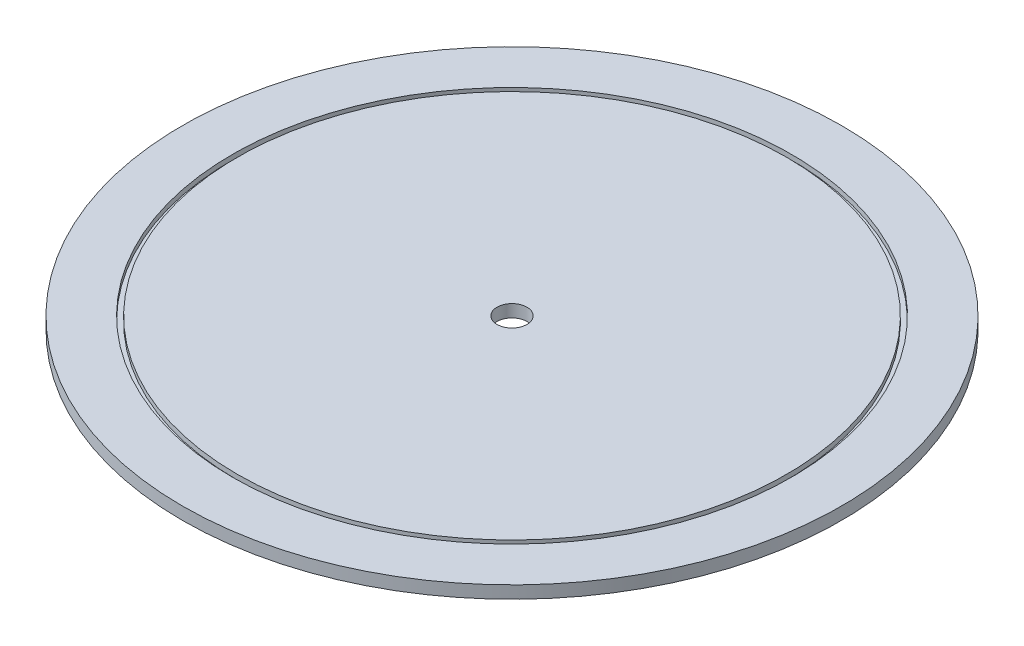
ISO-10303-21;
HEADER;
FILE_DESCRIPTION(('STEP AP214'),'2;1');
FILE_NAME('part.step','',(''),(''),'','','');
FILE_SCHEMA(('AUTOMOTIVE_DESIGN { 1 0 10303 214 1 1 1 1 }'));
ENDSEC;
DATA;
#1=APPLICATION_CONTEXT('core data for automotive mechanical design processes');
#2=APPLICATION_PROTOCOL_DEFINITION('international standard','automotive_design',2000,#1);
#3=PRODUCT_CONTEXT('',#1,'mechanical');
#4=PRODUCT('Part','Part','',(#3));
#5=PRODUCT_RELATED_PRODUCT_CATEGORY('part','',(#4));
#6=PRODUCT_DEFINITION_FORMATION('','',#4);
#7=PRODUCT_DEFINITION_CONTEXT('part definition',#1,'design');
#8=PRODUCT_DEFINITION('design','',#6,#7);
#9=PRODUCT_DEFINITION_SHAPE('','',#8);
#10=(LENGTH_UNIT() NAMED_UNIT(*) SI_UNIT(.MILLI.,.METRE.));
#11=(NAMED_UNIT(*) PLANE_ANGLE_UNIT() SI_UNIT($,.RADIAN.));
#12=(NAMED_UNIT(*) SI_UNIT($,.STERADIAN.) SOLID_ANGLE_UNIT());
#13=UNCERTAINTY_MEASURE_WITH_UNIT(LENGTH_MEASURE(1.E-05),#10,'distance_accuracy_value','');
#14=(GEOMETRIC_REPRESENTATION_CONTEXT(3) GLOBAL_UNCERTAINTY_ASSIGNED_CONTEXT((#13)) GLOBAL_UNIT_ASSIGNED_CONTEXT((#10,
#11,#12)) REPRESENTATION_CONTEXT('',''));
#15=CARTESIAN_POINT('',(0.,0.,0.));
#16=DIRECTION('',(0.,0.,1.));
#17=DIRECTION('',(1.,0.,0.));
#18=AXIS2_PLACEMENT_3D('',#15,#16,#17);
#19=CARTESIAN_POINT('',(0.,5.,0.));
#20=DIRECTION('',(0.,-1.,0.));
#21=DIRECTION('',(0.,0.,-1.));
#22=AXIS2_PLACEMENT_3D('',#19,#20,#21);
#23=CYLINDRICAL_SURFACE('',#22,132.);
#24=CARTESIAN_POINT('',(0.,5.,0.));
#25=DIRECTION('',(0.,1.,0.));
#26=DIRECTION('',(0.,0.,1.));
#27=AXIS2_PLACEMENT_3D('',#24,#25,#26);
#28=CIRCLE('',#27,132.);
#29=CARTESIAN_POINT('',(0.,5.,132.));
#30=VERTEX_POINT('',#29);
#31=EDGE_CURVE('E10',#30,#30,#28,.T.);
#32=ORIENTED_EDGE('',*,*,#31,.F.);
#33=EDGE_LOOP('',(#32));
#34=FACE_BOUND('',#33,.T.);
#35=CARTESIAN_POINT('',(0.,0.,0.));
#36=DIRECTION('',(0.,1.,0.));
#37=DIRECTION('',(0.,0.,1.));
#38=AXIS2_PLACEMENT_3D('',#35,#36,#37);
#39=CIRCLE('',#38,132.);
#40=CARTESIAN_POINT('',(0.,0.,132.));
#41=VERTEX_POINT('',#40);
#42=EDGE_CURVE('E46',#41,#41,#39,.T.);
#43=ORIENTED_EDGE('',*,*,#42,.T.);
#44=EDGE_LOOP('',(#43));
#45=FACE_BOUND('',#44,.T.);
#46=ADVANCED_FACE('F43',(#34,#45),#23,.T.);
#47=CARTESIAN_POINT('',(0.,5.,0.));
#48=DIRECTION('',(0.,1.,0.));
#49=DIRECTION('',(0.,0.,1.));
#50=AXIS2_PLACEMENT_3D('',#47,#48,#49);
#51=PLANE('',#50);
#52=CARTESIAN_POINT('',(0.,5.,0.));
#53=DIRECTION('',(0.,1.,0.));
#54=DIRECTION('',(0.,0.,1.));
#55=AXIS2_PLACEMENT_3D('',#52,#53,#54);
#56=CIRCLE('',#55,112.);
#57=CARTESIAN_POINT('',(0.,5.,112.));
#58=VERTEX_POINT('',#57);
#59=EDGE_CURVE('E57',#58,#58,#56,.T.);
#60=ORIENTED_EDGE('',*,*,#59,.F.);
#61=EDGE_LOOP('',(#60));
#62=FACE_BOUND('',#61,.T.);
#63=ORIENTED_EDGE('',*,*,#31,.T.);
#64=EDGE_LOOP('',(#63));
#65=FACE_BOUND('',#64,.T.);
#66=ADVANCED_FACE('F89',(#62,#65),#51,.T.);
#67=CARTESIAN_POINT('',(0.,0.,0.));
#68=DIRECTION('',(0.,1.,0.));
#69=DIRECTION('',(0.,0.,1.));
#70=AXIS2_PLACEMENT_3D('',#67,#68,#69);
#71=PLANE('',#70);
#72=CARTESIAN_POINT('',(0.,0.,0.));
#73=DIRECTION('',(0.,1.,0.));
#74=DIRECTION('',(0.,0.,1.));
#75=AXIS2_PLACEMENT_3D('',#72,#73,#74);
#76=CIRCLE('',#75,6.);
#77=CARTESIAN_POINT('',(0.,0.,6.));
#78=VERTEX_POINT('',#77);
#79=EDGE_CURVE('E69',#78,#78,#76,.T.);
#80=ORIENTED_EDGE('',*,*,#79,.T.);
#81=EDGE_LOOP('',(#80));
#82=FACE_BOUND('',#81,.T.);
#83=ORIENTED_EDGE('',*,*,#42,.F.);
#84=EDGE_LOOP('',(#83));
#85=FACE_BOUND('',#84,.T.);
#86=ADVANCED_FACE('F109',(#82,#85),#71,.F.);
#87=CARTESIAN_POINT('',(0.,3.,0.));
#88=DIRECTION('',(0.,1.,0.));
#89=DIRECTION('',(0.,0.,1.));
#90=AXIS2_PLACEMENT_3D('',#87,#88,#89);
#91=CYLINDRICAL_SURFACE('',#90,112.);
#92=CARTESIAN_POINT('',(0.,3.,0.));
#93=DIRECTION('',(0.,1.,0.));
#94=DIRECTION('',(0.,0.,1.));
#95=AXIS2_PLACEMENT_3D('',#92,#93,#94);
#96=CIRCLE('',#95,112.);
#97=CARTESIAN_POINT('',(0.,3.,112.));
#98=VERTEX_POINT('',#97);
#99=EDGE_CURVE('E55',#98,#98,#96,.T.);
#100=ORIENTED_EDGE('',*,*,#99,.F.);
#101=EDGE_LOOP('',(#100));
#102=FACE_BOUND('',#101,.T.);
#103=ORIENTED_EDGE('',*,*,#59,.T.);
#104=EDGE_LOOP('',(#103));
#105=FACE_BOUND('',#104,.T.);
#106=ADVANCED_FACE('F100',(#102,#105),#91,.F.);
#107=CARTESIAN_POINT('',(0.,3.,0.));
#108=DIRECTION('',(0.,1.,0.));
#109=DIRECTION('',(0.,0.,1.));
#110=AXIS2_PLACEMENT_3D('',#107,#108,#109);
#111=PLANE('',#110);
#112=CARTESIAN_POINT('',(0.,3.,0.));
#113=DIRECTION('',(0.,1.,0.));
#114=DIRECTION('',(0.,0.,1.));
#115=AXIS2_PLACEMENT_3D('',#112,#113,#114);
#116=CIRCLE('',#115,110.);
#117=CARTESIAN_POINT('',(0.,3.,110.));
#118=VERTEX_POINT('',#117);
#119=EDGE_CURVE('E61',#118,#118,#116,.T.);
#120=ORIENTED_EDGE('',*,*,#119,.F.);
#121=EDGE_LOOP('',(#120));
#122=FACE_BOUND('',#121,.T.);
#123=ORIENTED_EDGE('',*,*,#99,.T.);
#124=EDGE_LOOP('',(#123));
#125=FACE_BOUND('',#124,.T.);
#126=ADVANCED_FACE('F93',(#122,#125),#111,.T.);
#127=CARTESIAN_POINT('',(0.,3.,0.));
#128=DIRECTION('',(0.,1.,0.));
#129=DIRECTION('',(0.,0.,1.));
#130=AXIS2_PLACEMENT_3D('',#127,#128,#129);
#131=CYLINDRICAL_SURFACE('',#130,110.);
#132=ORIENTED_EDGE('',*,*,#119,.T.);
#133=EDGE_LOOP('',(#132));
#134=FACE_BOUND('',#133,.T.);
#135=CARTESIAN_POINT('',(0.,5.,0.));
#136=DIRECTION('',(0.,1.,0.));
#137=DIRECTION('',(0.,0.,1.));
#138=AXIS2_PLACEMENT_3D('',#135,#136,#137);
#139=CIRCLE('',#138,110.);
#140=CARTESIAN_POINT('',(0.,5.,110.));
#141=VERTEX_POINT('',#140);
#142=EDGE_CURVE('E65',#141,#141,#139,.T.);
#143=ORIENTED_EDGE('',*,*,#142,.F.);
#144=EDGE_LOOP('',(#143));
#145=FACE_BOUND('',#144,.T.);
#146=ADVANCED_FACE('F87',(#134,#145),#131,.T.);
#147=CARTESIAN_POINT('',(0.,5.,0.));
#148=DIRECTION('',(0.,1.,0.));
#149=DIRECTION('',(0.,0.,1.));
#150=AXIS2_PLACEMENT_3D('',#147,#148,#149);
#151=CIRCLE('',#150,6.);
#152=CARTESIAN_POINT('',(0.,5.,6.));
#153=VERTEX_POINT('',#152);
#154=EDGE_CURVE('E76',#153,#153,#151,.T.);
#155=ORIENTED_EDGE('',*,*,#154,.F.);
#156=EDGE_LOOP('',(#155));
#157=FACE_BOUND('',#156,.T.);
#158=ORIENTED_EDGE('',*,*,#142,.T.);
#159=EDGE_LOOP('',(#158));
#160=FACE_BOUND('',#159,.T.);
#161=ADVANCED_FACE('F84',(#157,#160),#51,.T.);
#162=CARTESIAN_POINT('',(0.,-17.,0.));
#163=DIRECTION('',(0.,1.,0.));
#164=DIRECTION('',(0.,0.,1.));
#165=AXIS2_PLACEMENT_3D('',#162,#163,#164);
#166=CYLINDRICAL_SURFACE('',#165,6.);
#167=ORIENTED_EDGE('',*,*,#154,.T.);
#168=EDGE_LOOP('',(#167));
#169=FACE_BOUND('',#168,.T.);
#170=ORIENTED_EDGE('',*,*,#79,.F.);
#171=EDGE_LOOP('',(#170));
#172=FACE_BOUND('',#171,.T.);
#173=ADVANCED_FACE('F81',(#169,#172),#166,.F.);
#174=CLOSED_SHELL('',(#46,#66,#86,#106,#126,#146,#161,#173));
#175=MANIFOLD_SOLID_BREP('B2',#174);
#176=ADVANCED_BREP_SHAPE_REPRESENTATION('',(#18,#175),#14);
#177=SHAPE_DEFINITION_REPRESENTATION(#9,#176);
ENDSEC;
END-ISO-10303-21;
